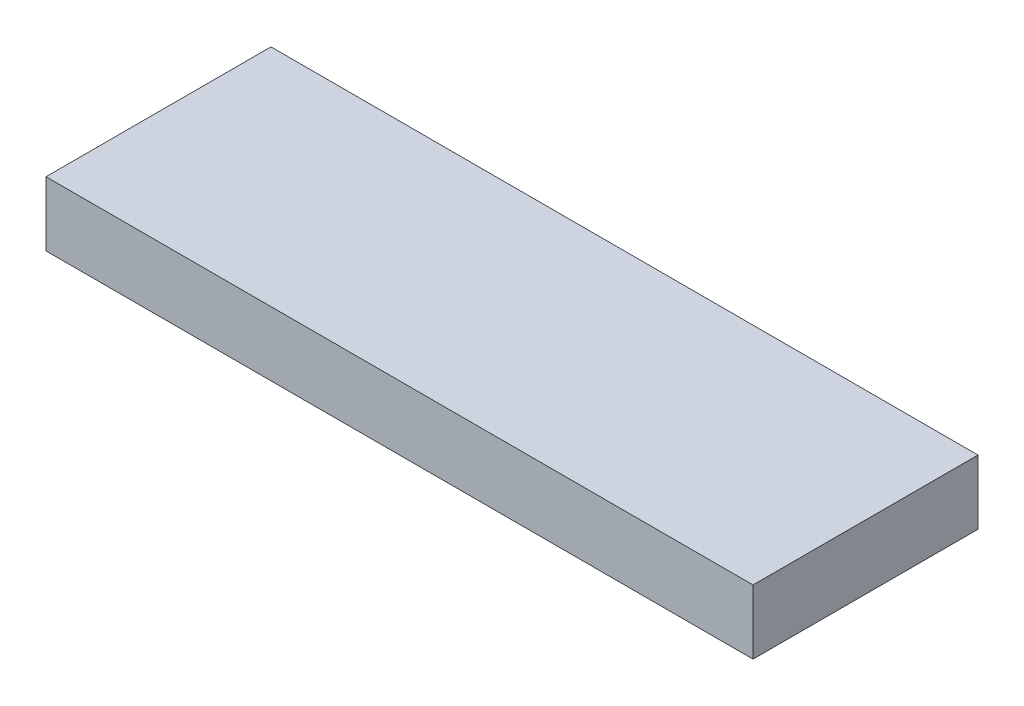
ISO-10303-21;
HEADER;
FILE_DESCRIPTION(('STEP AP214'),'2;1');
FILE_NAME('part.step','',(''),(''),'','','');
FILE_SCHEMA(('AUTOMOTIVE_DESIGN { 1 0 10303 214 1 1 1 1 }'));
ENDSEC;
DATA;
#1=APPLICATION_CONTEXT('core data for automotive mechanical design processes');
#2=APPLICATION_PROTOCOL_DEFINITION('international standard','automotive_design',2000,#1);
#3=PRODUCT_CONTEXT('',#1,'mechanical');
#4=PRODUCT('Part','Part','',(#3));
#5=PRODUCT_RELATED_PRODUCT_CATEGORY('part','',(#4));
#6=PRODUCT_DEFINITION_FORMATION('','',#4);
#7=PRODUCT_DEFINITION_CONTEXT('part definition',#1,'design');
#8=PRODUCT_DEFINITION('design','',#6,#7);
#9=PRODUCT_DEFINITION_SHAPE('','',#8);
#10=(LENGTH_UNIT() NAMED_UNIT(*) SI_UNIT(.MILLI.,.METRE.));
#11=(NAMED_UNIT(*) PLANE_ANGLE_UNIT() SI_UNIT($,.RADIAN.));
#12=(NAMED_UNIT(*) SI_UNIT($,.STERADIAN.) SOLID_ANGLE_UNIT());
#13=UNCERTAINTY_MEASURE_WITH_UNIT(LENGTH_MEASURE(1.E-05),#10,'distance_accuracy_value','');
#14=(GEOMETRIC_REPRESENTATION_CONTEXT(3) GLOBAL_UNCERTAINTY_ASSIGNED_CONTEXT((#13)) GLOBAL_UNIT_ASSIGNED_CONTEXT((#10,
#11,#12)) REPRESENTATION_CONTEXT('',''));
#15=CARTESIAN_POINT('',(0.,0.,0.));
#16=DIRECTION('',(0.,0.,1.));
#17=DIRECTION('',(1.,0.,0.));
#18=AXIS2_PLACEMENT_3D('',#15,#16,#17);
#19=CARTESIAN_POINT('',(0.,0.,7.));
#20=DIRECTION('',(1.,0.,0.));
#21=DIRECTION('',(0.,0.,-1.));
#22=AXIS2_PLACEMENT_3D('',#19,#20,#21);
#23=PLANE('',#22);
#24=DIRECTION('',(0.,-1.,0.));
#25=VECTOR('',#24,1.);
#26=CARTESIAN_POINT('',(0.,0.,0.));
#27=LINE('',#26,#25);
#28=CARTESIAN_POINT('',(0.,2.,0.));
#29=VERTEX_POINT('',#28);
#30=CARTESIAN_POINT('',(0.,0.,0.));
#31=VERTEX_POINT('',#30);
#32=EDGE_CURVE('E106',#29,#31,#27,.T.);
#33=ORIENTED_EDGE('',*,*,#32,.T.);
#34=DIRECTION('',(0.,0.,-1.));
#35=VECTOR('',#34,1.);
#36=CARTESIAN_POINT('',(0.,0.,7.));
#37=LINE('',#36,#35);
#38=CARTESIAN_POINT('',(0.,0.,7.));
#39=VERTEX_POINT('',#38);
#40=EDGE_CURVE('E11',#39,#31,#37,.T.);
#41=ORIENTED_EDGE('',*,*,#40,.F.);
#42=DIRECTION('',(0.,-1.,0.));
#43=VECTOR('',#42,1.);
#44=CARTESIAN_POINT('',(0.,0.,7.));
#45=LINE('',#44,#43);
#46=CARTESIAN_POINT('',(0.,2.,7.));
#47=VERTEX_POINT('',#46);
#48=EDGE_CURVE('E89',#47,#39,#45,.T.);
#49=ORIENTED_EDGE('',*,*,#48,.F.);
#50=DIRECTION('',(0.,0.,-1.));
#51=VECTOR('',#50,1.);
#52=CARTESIAN_POINT('',(0.,2.,7.));
#53=LINE('',#52,#51);
#54=EDGE_CURVE('E102',#47,#29,#53,.T.);
#55=ORIENTED_EDGE('',*,*,#54,.T.);
#56=EDGE_LOOP('',(#33,#41,#49,#55));
#57=FACE_BOUND('',#56,.T.);
#58=ADVANCED_FACE('F37',(#57),#23,.F.);
#59=CARTESIAN_POINT('',(0.,0.,7.));
#60=DIRECTION('',(0.,1.,0.));
#61=DIRECTION('',(0.,0.,1.));
#62=AXIS2_PLACEMENT_3D('',#59,#60,#61);
#63=PLANE('',#62);
#64=DIRECTION('',(1.,0.,0.));
#65=VECTOR('',#64,1.);
#66=CARTESIAN_POINT('',(0.,0.,0.));
#67=LINE('',#66,#65);
#68=CARTESIAN_POINT('',(22.,0.,0.));
#69=VERTEX_POINT('',#68);
#70=EDGE_CURVE('E94',#31,#69,#67,.T.);
#71=ORIENTED_EDGE('',*,*,#70,.T.);
#72=DIRECTION('',(0.,0.,-1.));
#73=VECTOR('',#72,1.);
#74=CARTESIAN_POINT('',(22.,0.,7.));
#75=LINE('',#74,#73);
#76=CARTESIAN_POINT('',(22.,0.,7.));
#77=VERTEX_POINT('',#76);
#78=EDGE_CURVE('E46',#77,#69,#75,.T.);
#79=ORIENTED_EDGE('',*,*,#78,.F.);
#80=DIRECTION('',(1.,0.,0.));
#81=VECTOR('',#80,1.);
#82=CARTESIAN_POINT('',(0.,0.,7.));
#83=LINE('',#82,#81);
#84=EDGE_CURVE('E84',#39,#77,#83,.T.);
#85=ORIENTED_EDGE('',*,*,#84,.F.);
#86=ORIENTED_EDGE('',*,*,#40,.T.);
#87=EDGE_LOOP('',(#71,#79,#85,#86));
#88=FACE_BOUND('',#87,.T.);
#89=ADVANCED_FACE('F93',(#88),#63,.F.);
#90=CARTESIAN_POINT('',(22.,0.,7.));
#91=DIRECTION('',(-1.,0.,0.));
#92=DIRECTION('',(0.,0.,1.));
#93=AXIS2_PLACEMENT_3D('',#90,#91,#92);
#94=PLANE('',#93);
#95=DIRECTION('',(0.,1.,0.));
#96=VECTOR('',#95,1.);
#97=CARTESIAN_POINT('',(22.,0.,0.));
#98=LINE('',#97,#96);
#99=CARTESIAN_POINT('',(22.,2.,0.));
#100=VERTEX_POINT('',#99);
#101=EDGE_CURVE('E71',#69,#100,#98,.T.);
#102=ORIENTED_EDGE('',*,*,#101,.T.);
#103=DIRECTION('',(0.,0.,-1.));
#104=VECTOR('',#103,1.);
#105=CARTESIAN_POINT('',(22.,2.,7.));
#106=LINE('',#105,#104);
#107=CARTESIAN_POINT('',(22.,2.,7.));
#108=VERTEX_POINT('',#107);
#109=EDGE_CURVE('E96',#108,#100,#106,.T.);
#110=ORIENTED_EDGE('',*,*,#109,.F.);
#111=DIRECTION('',(0.,1.,0.));
#112=VECTOR('',#111,1.);
#113=CARTESIAN_POINT('',(22.,0.,7.));
#114=LINE('',#113,#112);
#115=EDGE_CURVE('E87',#77,#108,#114,.T.);
#116=ORIENTED_EDGE('',*,*,#115,.F.);
#117=ORIENTED_EDGE('',*,*,#78,.T.);
#118=EDGE_LOOP('',(#102,#110,#116,#117));
#119=FACE_BOUND('',#118,.T.);
#120=ADVANCED_FACE('F97',(#119),#94,.F.);
#121=CARTESIAN_POINT('',(0.,2.,7.));
#122=DIRECTION('',(0.,-1.,0.));
#123=DIRECTION('',(0.,0.,-1.));
#124=AXIS2_PLACEMENT_3D('',#121,#122,#123);
#125=PLANE('',#124);
#126=DIRECTION('',(-1.,0.,0.));
#127=VECTOR('',#126,1.);
#128=CARTESIAN_POINT('',(0.,2.,0.));
#129=LINE('',#128,#127);
#130=EDGE_CURVE('E77',#100,#29,#129,.T.);
#131=ORIENTED_EDGE('',*,*,#130,.T.);
#132=ORIENTED_EDGE('',*,*,#54,.F.);
#133=DIRECTION('',(-1.,0.,0.));
#134=VECTOR('',#133,1.);
#135=CARTESIAN_POINT('',(0.,2.,7.));
#136=LINE('',#135,#134);
#137=EDGE_CURVE('E54',#108,#47,#136,.T.);
#138=ORIENTED_EDGE('',*,*,#137,.F.);
#139=ORIENTED_EDGE('',*,*,#109,.T.);
#140=EDGE_LOOP('',(#131,#132,#138,#139));
#141=FACE_BOUND('',#140,.T.);
#142=ADVANCED_FACE('F118',(#141),#125,.F.);
#143=CARTESIAN_POINT('',(0.,0.,7.));
#144=DIRECTION('',(0.,0.,-1.));
#145=DIRECTION('',(-1.,0.,0.));
#146=AXIS2_PLACEMENT_3D('',#143,#144,#145);
#147=PLANE('',#146);
#148=ORIENTED_EDGE('',*,*,#48,.T.);
#149=ORIENTED_EDGE('',*,*,#84,.T.);
#150=ORIENTED_EDGE('',*,*,#115,.T.);
#151=ORIENTED_EDGE('',*,*,#137,.T.);
#152=EDGE_LOOP('',(#148,#149,#150,#151));
#153=FACE_BOUND('',#152,.T.);
#154=ADVANCED_FACE('F85',(#153),#147,.F.);
#155=CARTESIAN_POINT('',(0.,0.,0.));
#156=DIRECTION('',(0.,0.,-1.));
#157=DIRECTION('',(-1.,0.,0.));
#158=AXIS2_PLACEMENT_3D('',#155,#156,#157);
#159=PLANE('',#158);
#160=ORIENTED_EDGE('',*,*,#32,.F.);
#161=ORIENTED_EDGE('',*,*,#130,.F.);
#162=ORIENTED_EDGE('',*,*,#101,.F.);
#163=ORIENTED_EDGE('',*,*,#70,.F.);
#164=EDGE_LOOP('',(#160,#161,#162,#163));
#165=FACE_BOUND('',#164,.T.);
#166=ADVANCED_FACE('F121',(#165),#159,.T.);
#167=CLOSED_SHELL('',(#58,#89,#120,#142,#154,#166));
#168=MANIFOLD_SOLID_BREP('B2',#167);
#169=ADVANCED_BREP_SHAPE_REPRESENTATION('',(#18,#168),#14);
#170=SHAPE_DEFINITION_REPRESENTATION(#9,#169);
ENDSEC;
END-ISO-10303-21;
